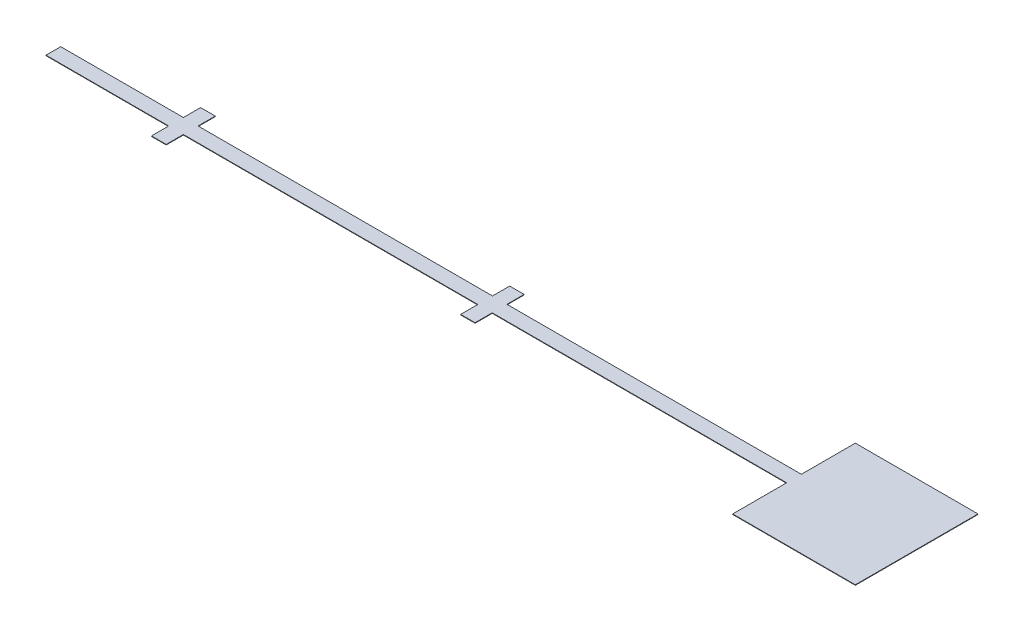
ISO-10303-21;
HEADER;
FILE_DESCRIPTION(('STEP AP214'),'2;1');
FILE_NAME('part.step','',(''),(''),'','','');
FILE_SCHEMA(('AUTOMOTIVE_DESIGN { 1 0 10303 214 1 1 1 1 }'));
ENDSEC;
DATA;
#1=APPLICATION_CONTEXT('core data for automotive mechanical design processes');
#2=APPLICATION_PROTOCOL_DEFINITION('international standard','automotive_design',2000,#1);
#3=PRODUCT_CONTEXT('',#1,'mechanical');
#4=PRODUCT('Part','Part','',(#3));
#5=PRODUCT_RELATED_PRODUCT_CATEGORY('part','',(#4));
#6=PRODUCT_DEFINITION_FORMATION('','',#4);
#7=PRODUCT_DEFINITION_CONTEXT('part definition',#1,'design');
#8=PRODUCT_DEFINITION('design','',#6,#7);
#9=PRODUCT_DEFINITION_SHAPE('','',#8);
#10=(LENGTH_UNIT() NAMED_UNIT(*) SI_UNIT(.MILLI.,.METRE.));
#11=(NAMED_UNIT(*) PLANE_ANGLE_UNIT() SI_UNIT($,.RADIAN.));
#12=(NAMED_UNIT(*) SI_UNIT($,.STERADIAN.) SOLID_ANGLE_UNIT());
#13=UNCERTAINTY_MEASURE_WITH_UNIT(LENGTH_MEASURE(1.E-05),#10,'distance_accuracy_value','');
#14=(GEOMETRIC_REPRESENTATION_CONTEXT(3) GLOBAL_UNCERTAINTY_ASSIGNED_CONTEXT((#13)) GLOBAL_UNIT_ASSIGNED_CONTEXT((#10,
#11,#12)) REPRESENTATION_CONTEXT('',''));
#15=CARTESIAN_POINT('',(0.,0.,0.));
#16=DIRECTION('',(0.,0.,1.));
#17=DIRECTION('',(1.,0.,0.));
#18=AXIS2_PLACEMENT_3D('',#15,#16,#17);
#19=CARTESIAN_POINT('',(25.5555555555556,1.,-42.7777777777778));
#20=DIRECTION('',(0.,0.,1.));
#21=DIRECTION('',(1.,0.,0.));
#22=AXIS2_PLACEMENT_3D('',#19,#20,#21);
#23=PLANE('',#22);
#24=DIRECTION('',(-1.,0.,0.));
#25=VECTOR('',#24,1.);
#26=CARTESIAN_POINT('',(25.5555555555556,0.,-42.7777777777778));
#27=LINE('',#26,#25);
#28=CARTESIAN_POINT('',(25.5555555555556,0.,-42.7777777777778));
#29=VERTEX_POINT('',#28);
#30=CARTESIAN_POINT('',(-224.444444444444,0.,-42.7777777777778));
#31=VERTEX_POINT('',#30);
#32=EDGE_CURVE('E225',#29,#31,#27,.T.);
#33=ORIENTED_EDGE('',*,*,#32,.T.);
#34=DIRECTION('',(0.,-1.,0.));
#35=VECTOR('',#34,1.);
#36=CARTESIAN_POINT('',(-224.444444444444,1.,-42.7777777777778));
#37=LINE('',#36,#35);
#38=CARTESIAN_POINT('',(-224.444444444444,1.,-42.7777777777778));
#39=VERTEX_POINT('',#38);
#40=EDGE_CURVE('E11',#39,#31,#37,.T.);
#41=ORIENTED_EDGE('',*,*,#40,.F.);
#42=DIRECTION('',(-1.,0.,0.));
#43=VECTOR('',#42,1.);
#44=CARTESIAN_POINT('',(25.5555555555556,1.,-42.7777777777778));
#45=LINE('',#44,#43);
#46=CARTESIAN_POINT('',(25.5555555555556,1.,-42.7777777777778));
#47=VERTEX_POINT('',#46);
#48=EDGE_CURVE('E271',#47,#39,#45,.T.);
#49=ORIENTED_EDGE('',*,*,#48,.F.);
#50=DIRECTION('',(0.,-1.,0.));
#51=VECTOR('',#50,1.);
#52=CARTESIAN_POINT('',(25.5555555555556,1.,-42.7777777777778));
#53=LINE('',#52,#51);
#54=EDGE_CURVE('E221',#47,#29,#53,.T.);
#55=ORIENTED_EDGE('',*,*,#54,.T.);
#56=EDGE_LOOP('',(#33,#41,#49,#55));
#57=FACE_BOUND('',#56,.T.);
#58=ADVANCED_FACE('F33',(#57),#23,.F.);
#59=CARTESIAN_POINT('',(-224.444444444444,1.,-42.7777777777778));
#60=DIRECTION('',(1.,0.,0.));
#61=DIRECTION('',(0.,0.,-1.));
#62=AXIS2_PLACEMENT_3D('',#59,#60,#61);
#63=PLANE('',#62);
#64=DIRECTION('',(0.,0.,1.));
#65=VECTOR('',#64,1.);
#66=CARTESIAN_POINT('',(-224.444444444444,0.,-42.7777777777778));
#67=LINE('',#66,#65);
#68=CARTESIAN_POINT('',(-224.444444444444,0.,-12.7777777777778));
#69=VERTEX_POINT('',#68);
#70=EDGE_CURVE('E228',#31,#69,#67,.T.);
#71=ORIENTED_EDGE('',*,*,#70,.T.);
#72=DIRECTION('',(0.,-1.,0.));
#73=VECTOR('',#72,1.);
#74=CARTESIAN_POINT('',(-224.444444444444,1.,-12.7777777777778));
#75=LINE('',#74,#73);
#76=CARTESIAN_POINT('',(-224.444444444444,1.,-12.7777777777778));
#77=VERTEX_POINT('',#76);
#78=EDGE_CURVE('E41',#77,#69,#75,.T.);
#79=ORIENTED_EDGE('',*,*,#78,.F.);
#80=DIRECTION('',(0.,0.,1.));
#81=VECTOR('',#80,1.);
#82=CARTESIAN_POINT('',(-224.444444444444,1.,-42.7777777777778));
#83=LINE('',#82,#81);
#84=EDGE_CURVE('E140',#39,#77,#83,.T.);
#85=ORIENTED_EDGE('',*,*,#84,.F.);
#86=ORIENTED_EDGE('',*,*,#40,.T.);
#87=EDGE_LOOP('',(#71,#79,#85,#86));
#88=FACE_BOUND('',#87,.T.);
#89=ADVANCED_FACE('F409',(#88),#63,.F.);
#90=CARTESIAN_POINT('',(-224.444444444444,1.,-12.7777777777778));
#91=DIRECTION('',(0.,0.,-1.));
#92=DIRECTION('',(-1.,0.,0.));
#93=AXIS2_PLACEMENT_3D('',#90,#91,#92);
#94=PLANE('',#93);
#95=DIRECTION('',(1.,0.,0.));
#96=VECTOR('',#95,1.);
#97=CARTESIAN_POINT('',(-224.444444444444,0.,-12.7777777777778));
#98=LINE('',#97,#96);
#99=CARTESIAN_POINT('',(25.5555555555556,0.,-12.7777777777778));
#100=VERTEX_POINT('',#99);
#101=EDGE_CURVE('E230',#69,#100,#98,.T.);
#102=ORIENTED_EDGE('',*,*,#101,.T.);
#103=DIRECTION('',(0.,-1.,0.));
#104=VECTOR('',#103,1.);
#105=CARTESIAN_POINT('',(25.5555555555556,1.,-12.7777777777778));
#106=LINE('',#105,#104);
#107=CARTESIAN_POINT('',(25.5555555555556,1.,-12.7777777777778));
#108=VERTEX_POINT('',#107);
#109=EDGE_CURVE('E326',#108,#100,#106,.T.);
#110=ORIENTED_EDGE('',*,*,#109,.F.);
#111=DIRECTION('',(1.,0.,0.));
#112=VECTOR('',#111,1.);
#113=CARTESIAN_POINT('',(-224.444444444444,1.,-12.7777777777778));
#114=LINE('',#113,#112);
#115=EDGE_CURVE('E334',#77,#108,#114,.T.);
#116=ORIENTED_EDGE('',*,*,#115,.F.);
#117=ORIENTED_EDGE('',*,*,#78,.T.);
#118=EDGE_LOOP('',(#102,#110,#116,#117));
#119=FACE_BOUND('',#118,.T.);
#120=ADVANCED_FACE('F332',(#119),#94,.F.);
#121=CARTESIAN_POINT('',(25.5555555555556,1.,-12.7777777777778));
#122=DIRECTION('',(1.,0.,0.));
#123=DIRECTION('',(0.,0.,-1.));
#124=AXIS2_PLACEMENT_3D('',#121,#122,#123);
#125=PLANE('',#124);
#126=DIRECTION('',(0.,0.,1.));
#127=VECTOR('',#126,1.);
#128=CARTESIAN_POINT('',(25.5555555555556,0.,-12.7777777777778));
#129=LINE('',#128,#127);
#130=CARTESIAN_POINT('',(25.5555555555556,0.,22.2222222222222));
#131=VERTEX_POINT('',#130);
#132=EDGE_CURVE('E232',#100,#131,#129,.T.);
#133=ORIENTED_EDGE('',*,*,#132,.T.);
#134=DIRECTION('',(0.,-1.,0.));
#135=VECTOR('',#134,1.);
#136=CARTESIAN_POINT('',(25.5555555555556,1.,22.2222222222222));
#137=LINE('',#136,#135);
#138=CARTESIAN_POINT('',(25.5555555555556,1.,22.2222222222222));
#139=VERTEX_POINT('',#138);
#140=EDGE_CURVE('E323',#139,#131,#137,.T.);
#141=ORIENTED_EDGE('',*,*,#140,.F.);
#142=DIRECTION('',(0.,0.,1.));
#143=VECTOR('',#142,1.);
#144=CARTESIAN_POINT('',(25.5555555555556,1.,-12.7777777777778));
#145=LINE('',#144,#143);
#146=EDGE_CURVE('E352',#108,#139,#145,.T.);
#147=ORIENTED_EDGE('',*,*,#146,.F.);
#148=ORIENTED_EDGE('',*,*,#109,.T.);
#149=EDGE_LOOP('',(#133,#141,#147,#148));
#150=FACE_BOUND('',#149,.T.);
#151=ADVANCED_FACE('F343',(#150),#125,.F.);
#152=CARTESIAN_POINT('',(25.5555555555556,1.,22.2222222222222));
#153=DIRECTION('',(0.,0.,-1.));
#154=DIRECTION('',(-1.,0.,0.));
#155=AXIS2_PLACEMENT_3D('',#152,#153,#154);
#156=PLANE('',#155);
#157=DIRECTION('',(1.,0.,0.));
#158=VECTOR('',#157,1.);
#159=CARTESIAN_POINT('',(25.5555555555556,0.,22.2222222222222));
#160=LINE('',#159,#158);
#161=CARTESIAN_POINT('',(55.5555555555556,0.,22.2222222222222));
#162=VERTEX_POINT('',#161);
#163=EDGE_CURVE('E234',#131,#162,#160,.T.);
#164=ORIENTED_EDGE('',*,*,#163,.T.);
#165=DIRECTION('',(0.,-1.,0.));
#166=VECTOR('',#165,1.);
#167=CARTESIAN_POINT('',(55.5555555555556,1.,22.2222222222222));
#168=LINE('',#167,#166);
#169=CARTESIAN_POINT('',(55.5555555555556,1.,22.2222222222222));
#170=VERTEX_POINT('',#169);
#171=EDGE_CURVE('E320',#170,#162,#168,.T.);
#172=ORIENTED_EDGE('',*,*,#171,.F.);
#173=DIRECTION('',(1.,0.,0.));
#174=VECTOR('',#173,1.);
#175=CARTESIAN_POINT('',(25.5555555555556,1.,22.2222222222222));
#176=LINE('',#175,#174);
#177=EDGE_CURVE('E349',#139,#170,#176,.T.);
#178=ORIENTED_EDGE('',*,*,#177,.F.);
#179=ORIENTED_EDGE('',*,*,#140,.T.);
#180=EDGE_LOOP('',(#164,#172,#178,#179));
#181=FACE_BOUND('',#180,.T.);
#182=ADVANCED_FACE('F347',(#181),#156,.F.);
#183=CARTESIAN_POINT('',(55.5555555555556,1.,22.2222222222222));
#184=DIRECTION('',(-1.,0.,0.));
#185=DIRECTION('',(0.,0.,1.));
#186=AXIS2_PLACEMENT_3D('',#183,#184,#185);
#187=PLANE('',#186);
#188=DIRECTION('',(0.,0.,-1.));
#189=VECTOR('',#188,1.);
#190=CARTESIAN_POINT('',(55.5555555555556,0.,22.2222222222222));
#191=LINE('',#190,#189);
#192=CARTESIAN_POINT('',(55.5555555555556,0.,-12.7777777777778));
#193=VERTEX_POINT('',#192);
#194=EDGE_CURVE('E236',#162,#193,#191,.T.);
#195=ORIENTED_EDGE('',*,*,#194,.T.);
#196=DIRECTION('',(0.,-1.,0.));
#197=VECTOR('',#196,1.);
#198=CARTESIAN_POINT('',(55.5555555555556,1.,-12.7777777777778));
#199=LINE('',#198,#197);
#200=CARTESIAN_POINT('',(55.5555555555556,1.,-12.7777777777778));
#201=VERTEX_POINT('',#200);
#202=EDGE_CURVE('E317',#201,#193,#199,.T.);
#203=ORIENTED_EDGE('',*,*,#202,.F.);
#204=DIRECTION('',(0.,0.,-1.));
#205=VECTOR('',#204,1.);
#206=CARTESIAN_POINT('',(55.5555555555556,1.,22.2222222222222));
#207=LINE('',#206,#205);
#208=EDGE_CURVE('E351',#170,#201,#207,.T.);
#209=ORIENTED_EDGE('',*,*,#208,.F.);
#210=ORIENTED_EDGE('',*,*,#171,.T.);
#211=EDGE_LOOP('',(#195,#203,#209,#210));
#212=FACE_BOUND('',#211,.T.);
#213=ADVANCED_FACE('F422',(#212),#187,.F.);
#214=CARTESIAN_POINT('',(55.5555555555556,1.,-12.7777777777778));
#215=DIRECTION('',(0.,0.,-1.));
#216=DIRECTION('',(-1.,0.,0.));
#217=AXIS2_PLACEMENT_3D('',#214,#215,#216);
#218=PLANE('',#217);
#219=DIRECTION('',(1.,0.,0.));
#220=VECTOR('',#219,1.);
#221=CARTESIAN_POINT('',(55.5555555555556,0.,-12.7777777777778));
#222=LINE('',#221,#220);
#223=CARTESIAN_POINT('',(655.555555555556,0.,-12.7777777777778));
#224=VERTEX_POINT('',#223);
#225=EDGE_CURVE('E238',#193,#224,#222,.T.);
#226=ORIENTED_EDGE('',*,*,#225,.T.);
#227=DIRECTION('',(0.,-1.,0.));
#228=VECTOR('',#227,1.);
#229=CARTESIAN_POINT('',(655.555555555556,1.,-12.7777777777778));
#230=LINE('',#229,#228);
#231=CARTESIAN_POINT('',(655.555555555556,1.,-12.7777777777778));
#232=VERTEX_POINT('',#231);
#233=EDGE_CURVE('E314',#232,#224,#230,.T.);
#234=ORIENTED_EDGE('',*,*,#233,.F.);
#235=DIRECTION('',(1.,0.,0.));
#236=VECTOR('',#235,1.);
#237=CARTESIAN_POINT('',(55.5555555555556,1.,-12.7777777777778));
#238=LINE('',#237,#236);
#239=EDGE_CURVE('E354',#201,#232,#238,.T.);
#240=ORIENTED_EDGE('',*,*,#239,.F.);
#241=ORIENTED_EDGE('',*,*,#202,.T.);
#242=EDGE_LOOP('',(#226,#234,#240,#241));
#243=FACE_BOUND('',#242,.T.);
#244=ADVANCED_FACE('F425',(#243),#218,.F.);
#245=CARTESIAN_POINT('',(655.555555555556,1.,-12.7777777777778));
#246=DIRECTION('',(1.,0.,0.));
#247=DIRECTION('',(0.,0.,-1.));
#248=AXIS2_PLACEMENT_3D('',#245,#246,#247);
#249=PLANE('',#248);
#250=DIRECTION('',(0.,0.,1.));
#251=VECTOR('',#250,1.);
#252=CARTESIAN_POINT('',(655.555555555556,0.,-12.7777777777778));
#253=LINE('',#252,#251);
#254=CARTESIAN_POINT('',(655.555555555556,0.,22.2222222222221));
#255=VERTEX_POINT('',#254);
#256=EDGE_CURVE('E240',#224,#255,#253,.T.);
#257=ORIENTED_EDGE('',*,*,#256,.T.);
#258=DIRECTION('',(0.,-1.,0.));
#259=VECTOR('',#258,1.);
#260=CARTESIAN_POINT('',(655.555555555556,1.,22.2222222222221));
#261=LINE('',#260,#259);
#262=CARTESIAN_POINT('',(655.555555555556,1.,22.2222222222221));
#263=VERTEX_POINT('',#262);
#264=EDGE_CURVE('E311',#263,#255,#261,.T.);
#265=ORIENTED_EDGE('',*,*,#264,.F.);
#266=DIRECTION('',(0.,0.,1.));
#267=VECTOR('',#266,1.);
#268=CARTESIAN_POINT('',(655.555555555556,1.,-12.7777777777778));
#269=LINE('',#268,#267);
#270=EDGE_CURVE('E360',#232,#263,#269,.T.);
#271=ORIENTED_EDGE('',*,*,#270,.F.);
#272=ORIENTED_EDGE('',*,*,#233,.T.);
#273=EDGE_LOOP('',(#257,#265,#271,#272));
#274=FACE_BOUND('',#273,.T.);
#275=ADVANCED_FACE('F429',(#274),#249,.F.);
#276=CARTESIAN_POINT('',(655.555555555556,1.,22.2222222222221));
#277=DIRECTION('',(0.,0.,-1.));
#278=DIRECTION('',(-1.,0.,0.));
#279=AXIS2_PLACEMENT_3D('',#276,#277,#278);
#280=PLANE('',#279);
#281=DIRECTION('',(1.,0.,0.));
#282=VECTOR('',#281,1.);
#283=CARTESIAN_POINT('',(655.555555555556,0.,22.2222222222221));
#284=LINE('',#283,#282);
#285=CARTESIAN_POINT('',(685.,0.,22.2222222222221));
#286=VERTEX_POINT('',#285);
#287=EDGE_CURVE('E242',#255,#286,#284,.T.);
#288=ORIENTED_EDGE('',*,*,#287,.T.);
#289=DIRECTION('',(0.,-1.,0.));
#290=VECTOR('',#289,1.);
#291=CARTESIAN_POINT('',(685.,1.,22.2222222222221));
#292=LINE('',#291,#290);
#293=CARTESIAN_POINT('',(685.,1.,22.2222222222221));
#294=VERTEX_POINT('',#293);
#295=EDGE_CURVE('E308',#294,#286,#292,.T.);
#296=ORIENTED_EDGE('',*,*,#295,.F.);
#297=DIRECTION('',(1.,0.,0.));
#298=VECTOR('',#297,1.);
#299=CARTESIAN_POINT('',(655.555555555556,1.,22.2222222222221));
#300=LINE('',#299,#298);
#301=EDGE_CURVE('E362',#263,#294,#300,.T.);
#302=ORIENTED_EDGE('',*,*,#301,.F.);
#303=ORIENTED_EDGE('',*,*,#264,.T.);
#304=EDGE_LOOP('',(#288,#296,#302,#303));
#305=FACE_BOUND('',#304,.T.);
#306=ADVANCED_FACE('F433',(#305),#280,.F.);
#307=CARTESIAN_POINT('',(685.,1.,22.2222222222221));
#308=DIRECTION('',(-1.,0.,0.));
#309=DIRECTION('',(0.,0.,1.));
#310=AXIS2_PLACEMENT_3D('',#307,#308,#309);
#311=PLANE('',#310);
#312=DIRECTION('',(0.,0.,-1.));
#313=VECTOR('',#312,1.);
#314=CARTESIAN_POINT('',(685.,0.,22.2222222222221));
#315=LINE('',#314,#313);
#316=CARTESIAN_POINT('',(685.,0.,-12.7777777777779));
#317=VERTEX_POINT('',#316);
#318=EDGE_CURVE('E244',#286,#317,#315,.T.);
#319=ORIENTED_EDGE('',*,*,#318,.T.);
#320=DIRECTION('',(0.,-1.,0.));
#321=VECTOR('',#320,1.);
#322=CARTESIAN_POINT('',(685.,1.,-12.7777777777779));
#323=LINE('',#322,#321);
#324=CARTESIAN_POINT('',(685.,1.,-12.7777777777779));
#325=VERTEX_POINT('',#324);
#326=EDGE_CURVE('E305',#325,#317,#323,.T.);
#327=ORIENTED_EDGE('',*,*,#326,.F.);
#328=DIRECTION('',(0.,0.,-1.));
#329=VECTOR('',#328,1.);
#330=CARTESIAN_POINT('',(685.,1.,22.2222222222221));
#331=LINE('',#330,#329);
#332=EDGE_CURVE('E364',#294,#325,#331,.T.);
#333=ORIENTED_EDGE('',*,*,#332,.F.);
#334=ORIENTED_EDGE('',*,*,#295,.T.);
#335=EDGE_LOOP('',(#319,#327,#333,#334));
#336=FACE_BOUND('',#335,.T.);
#337=ADVANCED_FACE('F437',(#336),#311,.F.);
#338=CARTESIAN_POINT('',(685.,1.,-12.7777777777779));
#339=DIRECTION('',(0.,0.,-1.));
#340=DIRECTION('',(-1.,0.,0.));
#341=AXIS2_PLACEMENT_3D('',#338,#339,#340);
#342=PLANE('',#341);
#343=DIRECTION('',(1.,0.,0.));
#344=VECTOR('',#343,1.);
#345=CARTESIAN_POINT('',(685.,0.,-12.7777777777779));
#346=LINE('',#345,#344);
#347=CARTESIAN_POINT('',(1285.,0.,-12.7777777777779));
#348=VERTEX_POINT('',#347);
#349=EDGE_CURVE('E246',#317,#348,#346,.T.);
#350=ORIENTED_EDGE('',*,*,#349,.T.);
#351=DIRECTION('',(0.,-1.,0.));
#352=VECTOR('',#351,1.);
#353=CARTESIAN_POINT('',(1285.,1.,-12.7777777777779));
#354=LINE('',#353,#352);
#355=CARTESIAN_POINT('',(1285.,1.,-12.7777777777779));
#356=VERTEX_POINT('',#355);
#357=EDGE_CURVE('E302',#356,#348,#354,.T.);
#358=ORIENTED_EDGE('',*,*,#357,.F.);
#359=DIRECTION('',(1.,0.,0.));
#360=VECTOR('',#359,1.);
#361=CARTESIAN_POINT('',(685.,1.,-12.7777777777779));
#362=LINE('',#361,#360);
#363=EDGE_CURVE('E366',#325,#356,#362,.T.);
#364=ORIENTED_EDGE('',*,*,#363,.F.);
#365=ORIENTED_EDGE('',*,*,#326,.T.);
#366=EDGE_LOOP('',(#350,#358,#364,#365));
#367=FACE_BOUND('',#366,.T.);
#368=ADVANCED_FACE('F441',(#367),#342,.F.);
#369=CARTESIAN_POINT('',(1285.,1.,-12.7777777777779));
#370=DIRECTION('',(1.,0.,0.));
#371=DIRECTION('',(0.,0.,-1.));
#372=AXIS2_PLACEMENT_3D('',#369,#370,#371);
#373=PLANE('',#372);
#374=DIRECTION('',(0.,0.,1.));
#375=VECTOR('',#374,1.);
#376=CARTESIAN_POINT('',(1285.,0.,-12.7777777777779));
#377=LINE('',#376,#375);
#378=CARTESIAN_POINT('',(1285.,0.,97.222222222222));
#379=VERTEX_POINT('',#378);
#380=EDGE_CURVE('E248',#348,#379,#377,.T.);
#381=ORIENTED_EDGE('',*,*,#380,.T.);
#382=DIRECTION('',(0.,-1.,0.));
#383=VECTOR('',#382,1.);
#384=CARTESIAN_POINT('',(1285.,1.,97.222222222222));
#385=LINE('',#384,#383);
#386=CARTESIAN_POINT('',(1285.,1.,97.222222222222));
#387=VERTEX_POINT('',#386);
#388=EDGE_CURVE('E299',#387,#379,#385,.T.);
#389=ORIENTED_EDGE('',*,*,#388,.F.);
#390=DIRECTION('',(0.,0.,1.));
#391=VECTOR('',#390,1.);
#392=CARTESIAN_POINT('',(1285.,1.,-12.7777777777779));
#393=LINE('',#392,#391);
#394=EDGE_CURVE('E368',#356,#387,#393,.T.);
#395=ORIENTED_EDGE('',*,*,#394,.F.);
#396=ORIENTED_EDGE('',*,*,#357,.T.);
#397=EDGE_LOOP('',(#381,#389,#395,#396));
#398=FACE_BOUND('',#397,.T.);
#399=ADVANCED_FACE('F445',(#398),#373,.F.);
#400=CARTESIAN_POINT('',(1285.,1.,97.222222222222));
#401=DIRECTION('',(0.,0.,-1.));
#402=DIRECTION('',(-1.,0.,0.));
#403=AXIS2_PLACEMENT_3D('',#400,#401,#402);
#404=PLANE('',#403);
#405=DIRECTION('',(1.,0.,0.));
#406=VECTOR('',#405,1.);
#407=CARTESIAN_POINT('',(1285.,0.,97.222222222222));
#408=LINE('',#407,#406);
#409=CARTESIAN_POINT('',(1535.,0.,97.222222222222));
#410=VERTEX_POINT('',#409);
#411=EDGE_CURVE('E250',#379,#410,#408,.T.);
#412=ORIENTED_EDGE('',*,*,#411,.T.);
#413=DIRECTION('',(0.,-1.,0.));
#414=VECTOR('',#413,1.);
#415=CARTESIAN_POINT('',(1535.,1.,97.222222222222));
#416=LINE('',#415,#414);
#417=CARTESIAN_POINT('',(1535.,1.,97.222222222222));
#418=VERTEX_POINT('',#417);
#419=EDGE_CURVE('E296',#418,#410,#416,.T.);
#420=ORIENTED_EDGE('',*,*,#419,.F.);
#421=DIRECTION('',(1.,0.,0.));
#422=VECTOR('',#421,1.);
#423=CARTESIAN_POINT('',(1285.,1.,97.222222222222));
#424=LINE('',#423,#422);
#425=EDGE_CURVE('E370',#387,#418,#424,.T.);
#426=ORIENTED_EDGE('',*,*,#425,.F.);
#427=ORIENTED_EDGE('',*,*,#388,.T.);
#428=EDGE_LOOP('',(#412,#420,#426,#427));
#429=FACE_BOUND('',#428,.T.);
#430=ADVANCED_FACE('F449',(#429),#404,.F.);
#431=CARTESIAN_POINT('',(1535.,1.,97.222222222222));
#432=DIRECTION('',(-1.,0.,0.));
#433=DIRECTION('',(0.,0.,1.));
#434=AXIS2_PLACEMENT_3D('',#431,#432,#433);
#435=PLANE('',#434);
#436=DIRECTION('',(0.,0.,-1.));
#437=VECTOR('',#436,1.);
#438=CARTESIAN_POINT('',(1535.,0.,97.222222222222));
#439=LINE('',#438,#437);
#440=CARTESIAN_POINT('',(1535.,0.,-152.777777777778));
#441=VERTEX_POINT('',#440);
#442=EDGE_CURVE('E252',#410,#441,#439,.T.);
#443=ORIENTED_EDGE('',*,*,#442,.T.);
#444=DIRECTION('',(0.,-1.,0.));
#445=VECTOR('',#444,1.);
#446=CARTESIAN_POINT('',(1535.,1.,-152.777777777778));
#447=LINE('',#446,#445);
#448=CARTESIAN_POINT('',(1535.,1.,-152.777777777778));
#449=VERTEX_POINT('',#448);
#450=EDGE_CURVE('E293',#449,#441,#447,.T.);
#451=ORIENTED_EDGE('',*,*,#450,.F.);
#452=DIRECTION('',(0.,0.,-1.));
#453=VECTOR('',#452,1.);
#454=CARTESIAN_POINT('',(1535.,1.,97.222222222222));
#455=LINE('',#454,#453);
#456=EDGE_CURVE('E372',#418,#449,#455,.T.);
#457=ORIENTED_EDGE('',*,*,#456,.F.);
#458=ORIENTED_EDGE('',*,*,#419,.T.);
#459=EDGE_LOOP('',(#443,#451,#457,#458));
#460=FACE_BOUND('',#459,.T.);
#461=ADVANCED_FACE('F453',(#460),#435,.F.);
#462=CARTESIAN_POINT('',(1535.,1.,-152.777777777778));
#463=DIRECTION('',(0.,0.,1.));
#464=DIRECTION('',(1.,0.,0.));
#465=AXIS2_PLACEMENT_3D('',#462,#463,#464);
#466=PLANE('',#465);
#467=DIRECTION('',(-1.,0.,0.));
#468=VECTOR('',#467,1.);
#469=CARTESIAN_POINT('',(1535.,0.,-152.777777777778));
#470=LINE('',#469,#468);
#471=CARTESIAN_POINT('',(1285.,0.,-152.777777777778));
#472=VERTEX_POINT('',#471);
#473=EDGE_CURVE('E254',#441,#472,#470,.T.);
#474=ORIENTED_EDGE('',*,*,#473,.T.);
#475=DIRECTION('',(0.,-1.,0.));
#476=VECTOR('',#475,1.);
#477=CARTESIAN_POINT('',(1285.,1.,-152.777777777778));
#478=LINE('',#477,#476);
#479=CARTESIAN_POINT('',(1285.,1.,-152.777777777778));
#480=VERTEX_POINT('',#479);
#481=EDGE_CURVE('E290',#480,#472,#478,.T.);
#482=ORIENTED_EDGE('',*,*,#481,.F.);
#483=DIRECTION('',(-1.,0.,0.));
#484=VECTOR('',#483,1.);
#485=CARTESIAN_POINT('',(1535.,1.,-152.777777777778));
#486=LINE('',#485,#484);
#487=EDGE_CURVE('E374',#449,#480,#486,.T.);
#488=ORIENTED_EDGE('',*,*,#487,.F.);
#489=ORIENTED_EDGE('',*,*,#450,.T.);
#490=EDGE_LOOP('',(#474,#482,#488,#489));
#491=FACE_BOUND('',#490,.T.);
#492=ADVANCED_FACE('F457',(#491),#466,.F.);
#493=CARTESIAN_POINT('',(1285.,1.,-152.777777777778));
#494=DIRECTION('',(1.,0.,0.));
#495=DIRECTION('',(0.,0.,-1.));
#496=AXIS2_PLACEMENT_3D('',#493,#494,#495);
#497=PLANE('',#496);
#498=DIRECTION('',(0.,0.,1.));
#499=VECTOR('',#498,1.);
#500=CARTESIAN_POINT('',(1285.,0.,-152.777777777778));
#501=LINE('',#500,#499);
#502=CARTESIAN_POINT('',(1285.,0.,-42.777777777778));
#503=VERTEX_POINT('',#502);
#504=EDGE_CURVE('E256',#472,#503,#501,.T.);
#505=ORIENTED_EDGE('',*,*,#504,.T.);
#506=DIRECTION('',(0.,-1.,0.));
#507=VECTOR('',#506,1.);
#508=CARTESIAN_POINT('',(1285.,1.,-42.777777777778));
#509=LINE('',#508,#507);
#510=CARTESIAN_POINT('',(1285.,1.,-42.777777777778));
#511=VERTEX_POINT('',#510);
#512=EDGE_CURVE('E287',#511,#503,#509,.T.);
#513=ORIENTED_EDGE('',*,*,#512,.F.);
#514=DIRECTION('',(0.,0.,1.));
#515=VECTOR('',#514,1.);
#516=CARTESIAN_POINT('',(1285.,1.,-152.777777777778));
#517=LINE('',#516,#515);
#518=EDGE_CURVE('E376',#480,#511,#517,.T.);
#519=ORIENTED_EDGE('',*,*,#518,.F.);
#520=ORIENTED_EDGE('',*,*,#481,.T.);
#521=EDGE_LOOP('',(#505,#513,#519,#520));
#522=FACE_BOUND('',#521,.T.);
#523=ADVANCED_FACE('F461',(#522),#497,.F.);
#524=CARTESIAN_POINT('',(1285.,1.,-42.777777777778));
#525=DIRECTION('',(0.,0.,1.));
#526=DIRECTION('',(1.,0.,0.));
#527=AXIS2_PLACEMENT_3D('',#524,#525,#526);
#528=PLANE('',#527);
#529=DIRECTION('',(-1.,0.,0.));
#530=VECTOR('',#529,1.);
#531=CARTESIAN_POINT('',(1285.,0.,-42.777777777778));
#532=LINE('',#531,#530);
#533=CARTESIAN_POINT('',(685.,0.,-42.7777777777779));
#534=VERTEX_POINT('',#533);
#535=EDGE_CURVE('E258',#503,#534,#532,.T.);
#536=ORIENTED_EDGE('',*,*,#535,.T.);
#537=DIRECTION('',(0.,-1.,0.));
#538=VECTOR('',#537,1.);
#539=CARTESIAN_POINT('',(685.,1.,-42.7777777777779));
#540=LINE('',#539,#538);
#541=CARTESIAN_POINT('',(685.,1.,-42.7777777777779));
#542=VERTEX_POINT('',#541);
#543=EDGE_CURVE('E284',#542,#534,#540,.T.);
#544=ORIENTED_EDGE('',*,*,#543,.F.);
#545=DIRECTION('',(-1.,0.,0.));
#546=VECTOR('',#545,1.);
#547=CARTESIAN_POINT('',(1285.,1.,-42.777777777778));
#548=LINE('',#547,#546);
#549=EDGE_CURVE('E378',#511,#542,#548,.T.);
#550=ORIENTED_EDGE('',*,*,#549,.F.);
#551=ORIENTED_EDGE('',*,*,#512,.T.);
#552=EDGE_LOOP('',(#536,#544,#550,#551));
#553=FACE_BOUND('',#552,.T.);
#554=ADVANCED_FACE('F465',(#553),#528,.F.);
#555=CARTESIAN_POINT('',(685.,1.,-42.7777777777779));
#556=DIRECTION('',(-1.,0.,0.));
#557=DIRECTION('',(0.,0.,1.));
#558=AXIS2_PLACEMENT_3D('',#555,#556,#557);
#559=PLANE('',#558);
#560=DIRECTION('',(0.,0.,-1.));
#561=VECTOR('',#560,1.);
#562=CARTESIAN_POINT('',(685.,0.,-42.7777777777779));
#563=LINE('',#562,#561);
#564=CARTESIAN_POINT('',(685.,0.,-77.7777777777779));
#565=VERTEX_POINT('',#564);
#566=EDGE_CURVE('E260',#534,#565,#563,.T.);
#567=ORIENTED_EDGE('',*,*,#566,.T.);
#568=DIRECTION('',(0.,-1.,0.));
#569=VECTOR('',#568,1.);
#570=CARTESIAN_POINT('',(685.,1.,-77.7777777777779));
#571=LINE('',#570,#569);
#572=CARTESIAN_POINT('',(685.,1.,-77.7777777777779));
#573=VERTEX_POINT('',#572);
#574=EDGE_CURVE('E281',#573,#565,#571,.T.);
#575=ORIENTED_EDGE('',*,*,#574,.F.);
#576=DIRECTION('',(0.,0.,-1.));
#577=VECTOR('',#576,1.);
#578=CARTESIAN_POINT('',(685.,1.,-42.7777777777779));
#579=LINE('',#578,#577);
#580=EDGE_CURVE('E380',#542,#573,#579,.T.);
#581=ORIENTED_EDGE('',*,*,#580,.F.);
#582=ORIENTED_EDGE('',*,*,#543,.T.);
#583=EDGE_LOOP('',(#567,#575,#581,#582));
#584=FACE_BOUND('',#583,.T.);
#585=ADVANCED_FACE('F469',(#584),#559,.F.);
#586=CARTESIAN_POINT('',(685.,1.,-77.7777777777779));
#587=DIRECTION('',(0.,0.,1.));
#588=DIRECTION('',(1.,0.,0.));
#589=AXIS2_PLACEMENT_3D('',#586,#587,#588);
#590=PLANE('',#589);
#591=DIRECTION('',(-1.,0.,0.));
#592=VECTOR('',#591,1.);
#593=CARTESIAN_POINT('',(685.,0.,-77.7777777777779));
#594=LINE('',#593,#592);
#595=CARTESIAN_POINT('',(655.555555555556,0.,-77.7777777777779));
#596=VERTEX_POINT('',#595);
#597=EDGE_CURVE('E262',#565,#596,#594,.T.);
#598=ORIENTED_EDGE('',*,*,#597,.T.);
#599=DIRECTION('',(0.,-1.,0.));
#600=VECTOR('',#599,1.);
#601=CARTESIAN_POINT('',(655.555555555556,1.,-77.7777777777779));
#602=LINE('',#601,#600);
#603=CARTESIAN_POINT('',(655.555555555556,1.,-77.7777777777779));
#604=VERTEX_POINT('',#603);
#605=EDGE_CURVE('E278',#604,#596,#602,.T.);
#606=ORIENTED_EDGE('',*,*,#605,.F.);
#607=DIRECTION('',(-1.,0.,0.));
#608=VECTOR('',#607,1.);
#609=CARTESIAN_POINT('',(685.,1.,-77.7777777777779));
#610=LINE('',#609,#608);
#611=EDGE_CURVE('E382',#573,#604,#610,.T.);
#612=ORIENTED_EDGE('',*,*,#611,.F.);
#613=ORIENTED_EDGE('',*,*,#574,.T.);
#614=EDGE_LOOP('',(#598,#606,#612,#613));
#615=FACE_BOUND('',#614,.T.);
#616=ADVANCED_FACE('F473',(#615),#590,.F.);
#617=CARTESIAN_POINT('',(655.555555555556,1.,-77.7777777777779));
#618=DIRECTION('',(1.,0.,0.));
#619=DIRECTION('',(0.,0.,-1.));
#620=AXIS2_PLACEMENT_3D('',#617,#618,#619);
#621=PLANE('',#620);
#622=DIRECTION('',(0.,0.,1.));
#623=VECTOR('',#622,1.);
#624=CARTESIAN_POINT('',(655.555555555556,0.,-77.7777777777779));
#625=LINE('',#624,#623);
#626=CARTESIAN_POINT('',(655.555555555556,0.,-42.7777777777778));
#627=VERTEX_POINT('',#626);
#628=EDGE_CURVE('E264',#596,#627,#625,.T.);
#629=ORIENTED_EDGE('',*,*,#628,.T.);
#630=DIRECTION('',(0.,-1.,0.));
#631=VECTOR('',#630,1.);
#632=CARTESIAN_POINT('',(655.555555555556,1.,-42.7777777777778));
#633=LINE('',#632,#631);
#634=CARTESIAN_POINT('',(655.555555555556,1.,-42.7777777777778));
#635=VERTEX_POINT('',#634);
#636=EDGE_CURVE('E275',#635,#627,#633,.T.);
#637=ORIENTED_EDGE('',*,*,#636,.F.);
#638=DIRECTION('',(0.,0.,1.));
#639=VECTOR('',#638,1.);
#640=CARTESIAN_POINT('',(655.555555555556,1.,-77.7777777777779));
#641=LINE('',#640,#639);
#642=EDGE_CURVE('E384',#604,#635,#641,.T.);
#643=ORIENTED_EDGE('',*,*,#642,.F.);
#644=ORIENTED_EDGE('',*,*,#605,.T.);
#645=EDGE_LOOP('',(#629,#637,#643,#644));
#646=FACE_BOUND('',#645,.T.);
#647=ADVANCED_FACE('F390',(#646),#621,.F.);
#648=CARTESIAN_POINT('',(655.555555555556,1.,-42.7777777777778));
#649=DIRECTION('',(0.,0.,1.));
#650=DIRECTION('',(1.,0.,0.));
#651=AXIS2_PLACEMENT_3D('',#648,#649,#650);
#652=PLANE('',#651);
#653=DIRECTION('',(-1.,0.,0.));
#654=VECTOR('',#653,1.);
#655=CARTESIAN_POINT('',(655.555555555556,0.,-42.7777777777778));
#656=LINE('',#655,#654);
#657=CARTESIAN_POINT('',(55.5555555555556,0.,-42.7777777777778));
#658=VERTEX_POINT('',#657);
#659=EDGE_CURVE('E266',#627,#658,#656,.T.);
#660=ORIENTED_EDGE('',*,*,#659,.T.);
#661=DIRECTION('',(0.,-1.,0.));
#662=VECTOR('',#661,1.);
#663=CARTESIAN_POINT('',(55.5555555555556,1.,-42.7777777777778));
#664=LINE('',#663,#662);
#665=CARTESIAN_POINT('',(55.5555555555556,1.,-42.7777777777778));
#666=VERTEX_POINT('',#665);
#667=EDGE_CURVE('E216',#666,#658,#664,.T.);
#668=ORIENTED_EDGE('',*,*,#667,.F.);
#669=DIRECTION('',(-1.,0.,0.));
#670=VECTOR('',#669,1.);
#671=CARTESIAN_POINT('',(655.555555555556,1.,-42.7777777777778));
#672=LINE('',#671,#670);
#673=EDGE_CURVE('E207',#635,#666,#672,.T.);
#674=ORIENTED_EDGE('',*,*,#673,.F.);
#675=ORIENTED_EDGE('',*,*,#636,.T.);
#676=EDGE_LOOP('',(#660,#668,#674,#675));
#677=FACE_BOUND('',#676,.T.);
#678=ADVANCED_FACE('F394',(#677),#652,.F.);
#679=CARTESIAN_POINT('',(55.5555555555556,1.,-42.7777777777778));
#680=DIRECTION('',(-1.,0.,0.));
#681=DIRECTION('',(0.,0.,1.));
#682=AXIS2_PLACEMENT_3D('',#679,#680,#681);
#683=PLANE('',#682);
#684=DIRECTION('',(0.,0.,-1.));
#685=VECTOR('',#684,1.);
#686=CARTESIAN_POINT('',(55.5555555555556,0.,-42.7777777777778));
#687=LINE('',#686,#685);
#688=CARTESIAN_POINT('',(55.5555555555556,0.,-77.7777777777778));
#689=VERTEX_POINT('',#688);
#690=EDGE_CURVE('E215',#658,#689,#687,.T.);
#691=ORIENTED_EDGE('',*,*,#690,.T.);
#692=DIRECTION('',(0.,-1.,0.));
#693=VECTOR('',#692,1.);
#694=CARTESIAN_POINT('',(55.5555555555556,1.,-77.7777777777778));
#695=LINE('',#694,#693);
#696=CARTESIAN_POINT('',(55.5555555555556,1.,-77.7777777777778));
#697=VERTEX_POINT('',#696);
#698=EDGE_CURVE('E212',#697,#689,#695,.T.);
#699=ORIENTED_EDGE('',*,*,#698,.F.);
#700=DIRECTION('',(0.,0.,-1.));
#701=VECTOR('',#700,1.);
#702=CARTESIAN_POINT('',(55.5555555555556,1.,-42.7777777777778));
#703=LINE('',#702,#701);
#704=EDGE_CURVE('E201',#666,#697,#703,.T.);
#705=ORIENTED_EDGE('',*,*,#704,.F.);
#706=ORIENTED_EDGE('',*,*,#667,.T.);
#707=EDGE_LOOP('',(#691,#699,#705,#706));
#708=FACE_BOUND('',#707,.T.);
#709=ADVANCED_FACE('F213',(#708),#683,.F.);
#710=CARTESIAN_POINT('',(55.5555555555556,1.,-77.7777777777778));
#711=DIRECTION('',(0.,0.,1.));
#712=DIRECTION('',(1.,0.,0.));
#713=AXIS2_PLACEMENT_3D('',#710,#711,#712);
#714=PLANE('',#713);
#715=DIRECTION('',(-1.,0.,0.));
#716=VECTOR('',#715,1.);
#717=CARTESIAN_POINT('',(55.5555555555556,0.,-77.7777777777778));
#718=LINE('',#717,#716);
#719=CARTESIAN_POINT('',(25.5555555555556,0.,-77.7777777777778));
#720=VERTEX_POINT('',#719);
#721=EDGE_CURVE('E126',#689,#720,#718,.T.);
#722=ORIENTED_EDGE('',*,*,#721,.T.);
#723=DIRECTION('',(0.,-1.,0.));
#724=VECTOR('',#723,1.);
#725=CARTESIAN_POINT('',(25.5555555555556,1.,-77.7777777777778));
#726=LINE('',#725,#724);
#727=CARTESIAN_POINT('',(25.5555555555556,1.,-77.7777777777778));
#728=VERTEX_POINT('',#727);
#729=EDGE_CURVE('E217',#728,#720,#726,.T.);
#730=ORIENTED_EDGE('',*,*,#729,.F.);
#731=DIRECTION('',(-1.,0.,0.));
#732=VECTOR('',#731,1.);
#733=CARTESIAN_POINT('',(55.5555555555556,1.,-77.7777777777778));
#734=LINE('',#733,#732);
#735=EDGE_CURVE('E205',#697,#728,#734,.T.);
#736=ORIENTED_EDGE('',*,*,#735,.F.);
#737=ORIENTED_EDGE('',*,*,#698,.T.);
#738=EDGE_LOOP('',(#722,#730,#736,#737));
#739=FACE_BOUND('',#738,.T.);
#740=ADVANCED_FACE('F219',(#739),#714,.F.);
#741=CARTESIAN_POINT('',(25.5555555555556,1.,-77.7777777777778));
#742=DIRECTION('',(1.,0.,0.));
#743=DIRECTION('',(0.,0.,-1.));
#744=AXIS2_PLACEMENT_3D('',#741,#742,#743);
#745=PLANE('',#744);
#746=DIRECTION('',(0.,0.,1.));
#747=VECTOR('',#746,1.);
#748=CARTESIAN_POINT('',(25.5555555555556,0.,-77.7777777777778));
#749=LINE('',#748,#747);
#750=EDGE_CURVE('E132',#720,#29,#749,.T.);
#751=ORIENTED_EDGE('',*,*,#750,.T.);
#752=ORIENTED_EDGE('',*,*,#54,.F.);
#753=DIRECTION('',(0.,0.,1.));
#754=VECTOR('',#753,1.);
#755=CARTESIAN_POINT('',(25.5555555555556,1.,-77.7777777777778));
#756=LINE('',#755,#754);
#757=EDGE_CURVE('E49',#728,#47,#756,.T.);
#758=ORIENTED_EDGE('',*,*,#757,.F.);
#759=ORIENTED_EDGE('',*,*,#729,.T.);
#760=EDGE_LOOP('',(#751,#752,#758,#759));
#761=FACE_BOUND('',#760,.T.);
#762=ADVANCED_FACE('F398',(#761),#745,.F.);
#763=CARTESIAN_POINT('',(0.,1.,0.));
#764=DIRECTION('',(0.,1.,0.));
#765=DIRECTION('',(0.,0.,1.));
#766=AXIS2_PLACEMENT_3D('',#763,#764,#765);
#767=PLANE('',#766);
#768=ORIENTED_EDGE('',*,*,#48,.T.);
#769=ORIENTED_EDGE('',*,*,#84,.T.);
#770=ORIENTED_EDGE('',*,*,#115,.T.);
#771=ORIENTED_EDGE('',*,*,#146,.T.);
#772=ORIENTED_EDGE('',*,*,#177,.T.);
#773=ORIENTED_EDGE('',*,*,#208,.T.);
#774=ORIENTED_EDGE('',*,*,#239,.T.);
#775=ORIENTED_EDGE('',*,*,#270,.T.);
#776=ORIENTED_EDGE('',*,*,#301,.T.);
#777=ORIENTED_EDGE('',*,*,#332,.T.);
#778=ORIENTED_EDGE('',*,*,#363,.T.);
#779=ORIENTED_EDGE('',*,*,#394,.T.);
#780=ORIENTED_EDGE('',*,*,#425,.T.);
#781=ORIENTED_EDGE('',*,*,#456,.T.);
#782=ORIENTED_EDGE('',*,*,#487,.T.);
#783=ORIENTED_EDGE('',*,*,#518,.T.);
#784=ORIENTED_EDGE('',*,*,#549,.T.);
#785=ORIENTED_EDGE('',*,*,#580,.T.);
#786=ORIENTED_EDGE('',*,*,#611,.T.);
#787=ORIENTED_EDGE('',*,*,#642,.T.);
#788=ORIENTED_EDGE('',*,*,#673,.T.);
#789=ORIENTED_EDGE('',*,*,#704,.T.);
#790=ORIENTED_EDGE('',*,*,#735,.T.);
#791=ORIENTED_EDGE('',*,*,#757,.T.);
#792=EDGE_LOOP('',(#768,#769,#770,#771,#772,#773,#774,#775,#776,#777,#778,#779,#780,#781,#782,
#783,#784,#785,#786,#787,#788,#789,#790,#791));
#793=FACE_BOUND('',#792,.T.);
#794=ADVANCED_FACE('F203',(#793),#767,.T.);
#795=CARTESIAN_POINT('',(0.,0.,0.));
#796=DIRECTION('',(0.,1.,0.));
#797=DIRECTION('',(0.,0.,1.));
#798=AXIS2_PLACEMENT_3D('',#795,#796,#797);
#799=PLANE('',#798);
#800=ORIENTED_EDGE('',*,*,#32,.F.);
#801=ORIENTED_EDGE('',*,*,#750,.F.);
#802=ORIENTED_EDGE('',*,*,#721,.F.);
#803=ORIENTED_EDGE('',*,*,#690,.F.);
#804=ORIENTED_EDGE('',*,*,#659,.F.);
#805=ORIENTED_EDGE('',*,*,#628,.F.);
#806=ORIENTED_EDGE('',*,*,#597,.F.);
#807=ORIENTED_EDGE('',*,*,#566,.F.);
#808=ORIENTED_EDGE('',*,*,#535,.F.);
#809=ORIENTED_EDGE('',*,*,#504,.F.);
#810=ORIENTED_EDGE('',*,*,#473,.F.);
#811=ORIENTED_EDGE('',*,*,#442,.F.);
#812=ORIENTED_EDGE('',*,*,#411,.F.);
#813=ORIENTED_EDGE('',*,*,#380,.F.);
#814=ORIENTED_EDGE('',*,*,#349,.F.);
#815=ORIENTED_EDGE('',*,*,#318,.F.);
#816=ORIENTED_EDGE('',*,*,#287,.F.);
#817=ORIENTED_EDGE('',*,*,#256,.F.);
#818=ORIENTED_EDGE('',*,*,#225,.F.);
#819=ORIENTED_EDGE('',*,*,#194,.F.);
#820=ORIENTED_EDGE('',*,*,#163,.F.);
#821=ORIENTED_EDGE('',*,*,#132,.F.);
#822=ORIENTED_EDGE('',*,*,#101,.F.);
#823=ORIENTED_EDGE('',*,*,#70,.F.);
#824=EDGE_LOOP('',(#800,#801,#802,#803,#804,#805,#806,#807,#808,#809,#810,#811,#812,#813,#814,
#815,#816,#817,#818,#819,#820,#821,#822,#823));
#825=FACE_BOUND('',#824,.T.);
#826=ADVANCED_FACE('F338',(#825),#799,.F.);
#827=CLOSED_SHELL('',(#58,#89,#120,#151,#182,#213,#244,#275,#306,#337,#368,#399,#430,#461,#492,
#523,#554,#585,#616,#647,#678,#709,#740,#762,#794,#826));
#828=MANIFOLD_SOLID_BREP('B2',#827);
#829=ADVANCED_BREP_SHAPE_REPRESENTATION('',(#18,#828),#14);
#830=SHAPE_DEFINITION_REPRESENTATION(#9,#829);
ENDSEC;
END-ISO-10303-21;
